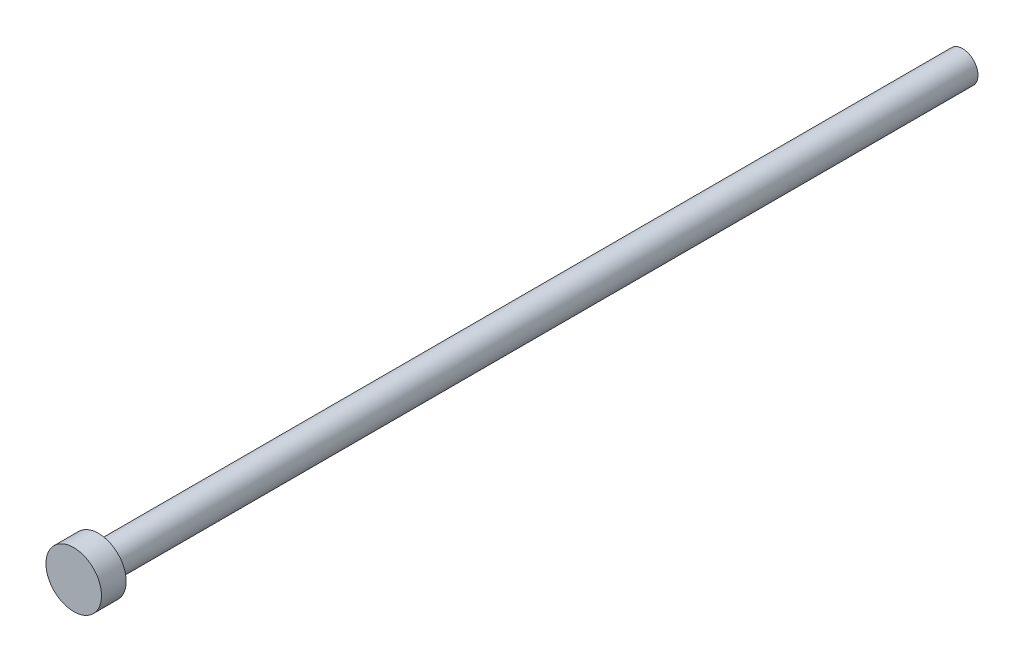
ISO-10303-21;
HEADER;
FILE_DESCRIPTION(('STEP AP214'),'2;1');
FILE_NAME('part.step','',(''),(''),'','','');
FILE_SCHEMA(('AUTOMOTIVE_DESIGN { 1 0 10303 214 1 1 1 1 }'));
ENDSEC;
DATA;
#1=APPLICATION_CONTEXT('core data for automotive mechanical design processes');
#2=APPLICATION_PROTOCOL_DEFINITION('international standard','automotive_design',2000,#1);
#3=PRODUCT_CONTEXT('',#1,'mechanical');
#4=PRODUCT('Part','Part','',(#3));
#5=PRODUCT_RELATED_PRODUCT_CATEGORY('part','',(#4));
#6=PRODUCT_DEFINITION_FORMATION('','',#4);
#7=PRODUCT_DEFINITION_CONTEXT('part definition',#1,'design');
#8=PRODUCT_DEFINITION('design','',#6,#7);
#9=PRODUCT_DEFINITION_SHAPE('','',#8);
#10=(LENGTH_UNIT() NAMED_UNIT(*) SI_UNIT(.MILLI.,.METRE.));
#11=(NAMED_UNIT(*) PLANE_ANGLE_UNIT() SI_UNIT($,.RADIAN.));
#12=(NAMED_UNIT(*) SI_UNIT($,.STERADIAN.) SOLID_ANGLE_UNIT());
#13=UNCERTAINTY_MEASURE_WITH_UNIT(LENGTH_MEASURE(1.E-05),#10,'distance_accuracy_value','');
#14=(GEOMETRIC_REPRESENTATION_CONTEXT(3) GLOBAL_UNCERTAINTY_ASSIGNED_CONTEXT((#13)) GLOBAL_UNIT_ASSIGNED_CONTEXT((#10,
#11,#12)) REPRESENTATION_CONTEXT('',''));
#15=CARTESIAN_POINT('',(0.,0.,0.));
#16=DIRECTION('',(0.,0.,1.));
#17=DIRECTION('',(1.,0.,0.));
#18=AXIS2_PLACEMENT_3D('',#15,#16,#17);
#19=CARTESIAN_POINT('',(-111.,111.,513.));
#20=DIRECTION('',(0.,0.,-1.));
#21=DIRECTION('',(-1.,0.,0.));
#22=AXIS2_PLACEMENT_3D('',#19,#20,#21);
#23=CYLINDRICAL_SURFACE('',#22,8.99999999999999);
#24=CARTESIAN_POINT('',(-111.,111.,513.));
#25=DIRECTION('',(0.,0.,1.));
#26=DIRECTION('',(1.,0.,0.));
#27=AXIS2_PLACEMENT_3D('',#24,#25,#26);
#28=CIRCLE('',#27,8.99999999999999);
#29=CARTESIAN_POINT('',(-102.,111.,513.));
#30=VERTEX_POINT('',#29);
#31=EDGE_CURVE('E10',#30,#30,#28,.T.);
#32=ORIENTED_EDGE('',*,*,#31,.F.);
#33=EDGE_LOOP('',(#32));
#34=FACE_BOUND('',#33,.T.);
#35=CARTESIAN_POINT('',(-111.,111.,505.));
#36=DIRECTION('',(0.,0.,1.));
#37=DIRECTION('',(1.,0.,0.));
#38=AXIS2_PLACEMENT_3D('',#35,#36,#37);
#39=CIRCLE('',#38,8.99999999999999);
#40=CARTESIAN_POINT('',(-102.,111.,505.));
#41=VERTEX_POINT('',#40);
#42=EDGE_CURVE('E45',#41,#41,#39,.T.);
#43=ORIENTED_EDGE('',*,*,#42,.T.);
#44=EDGE_LOOP('',(#43));
#45=FACE_BOUND('',#44,.T.);
#46=ADVANCED_FACE('F39',(#34,#45),#23,.T.);
#47=CARTESIAN_POINT('',(-111.,111.,513.));
#48=DIRECTION('',(0.,0.,1.));
#49=DIRECTION('',(1.,0.,0.));
#50=AXIS2_PLACEMENT_3D('',#47,#48,#49);
#51=PLANE('',#50);
#52=ORIENTED_EDGE('',*,*,#31,.T.);
#53=EDGE_LOOP('',(#52));
#54=FACE_BOUND('',#53,.T.);
#55=ADVANCED_FACE('F72',(#54),#51,.T.);
#56=CARTESIAN_POINT('',(-111.,111.,505.));
#57=DIRECTION('',(0.,0.,1.));
#58=DIRECTION('',(1.,0.,0.));
#59=AXIS2_PLACEMENT_3D('',#56,#57,#58);
#60=PLANE('',#59);
#61=CARTESIAN_POINT('',(-111.,111.,505.));
#62=DIRECTION('',(0.,0.,1.));
#63=DIRECTION('',(1.,0.,0.));
#64=AXIS2_PLACEMENT_3D('',#61,#62,#63);
#65=CIRCLE('',#64,5.);
#66=CARTESIAN_POINT('',(-106.,111.,505.));
#67=VERTEX_POINT('',#66);
#68=EDGE_CURVE('E47',#67,#67,#65,.T.);
#69=ORIENTED_EDGE('',*,*,#68,.T.);
#70=EDGE_LOOP('',(#69));
#71=FACE_BOUND('',#70,.T.);
#72=ORIENTED_EDGE('',*,*,#42,.F.);
#73=EDGE_LOOP('',(#72));
#74=FACE_BOUND('',#73,.T.);
#75=ADVANCED_FACE('F60',(#71,#74),#60,.F.);
#76=CARTESIAN_POINT('',(-111.,111.,505.));
#77=DIRECTION('',(0.,0.,-1.));
#78=DIRECTION('',(-1.,0.,0.));
#79=AXIS2_PLACEMENT_3D('',#76,#77,#78);
#80=CYLINDRICAL_SURFACE('',#79,5.);
#81=ORIENTED_EDGE('',*,*,#68,.F.);
#82=EDGE_LOOP('',(#81));
#83=FACE_BOUND('',#82,.T.);
#84=CARTESIAN_POINT('',(-111.,111.,225.));
#85=DIRECTION('',(0.,0.,1.));
#86=DIRECTION('',(1.,0.,0.));
#87=AXIS2_PLACEMENT_3D('',#84,#85,#86);
#88=CIRCLE('',#87,5.);
#89=CARTESIAN_POINT('',(-106.,111.,225.));
#90=VERTEX_POINT('',#89);
#91=EDGE_CURVE('E51',#90,#90,#88,.T.);
#92=ORIENTED_EDGE('',*,*,#91,.T.);
#93=EDGE_LOOP('',(#92));
#94=FACE_BOUND('',#93,.T.);
#95=ADVANCED_FACE('F58',(#83,#94),#80,.T.);
#96=CARTESIAN_POINT('',(-111.,111.,225.));
#97=DIRECTION('',(0.,0.,1.));
#98=DIRECTION('',(1.,0.,0.));
#99=AXIS2_PLACEMENT_3D('',#96,#97,#98);
#100=PLANE('',#99);
#101=ORIENTED_EDGE('',*,*,#91,.F.);
#102=EDGE_LOOP('',(#101));
#103=FACE_BOUND('',#102,.T.);
#104=ADVANCED_FACE('F64',(#103),#100,.F.);
#105=CLOSED_SHELL('',(#46,#55,#75,#95,#104));
#106=MANIFOLD_SOLID_BREP('B2',#105);
#107=ADVANCED_BREP_SHAPE_REPRESENTATION('',(#18,#106),#14);
#108=SHAPE_DEFINITION_REPRESENTATION(#9,#107);
ENDSEC;
END-ISO-10303-21;
